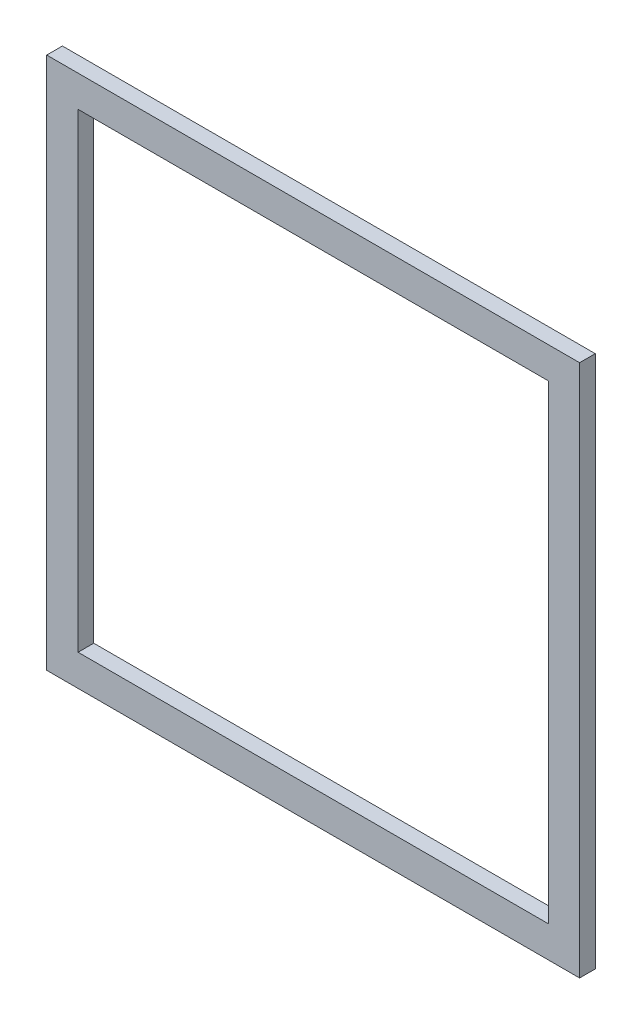
ISO-10303-21;
HEADER;
FILE_DESCRIPTION(('STEP AP214'),'2;1');
FILE_NAME('part.step','',(''),(''),'','','');
FILE_SCHEMA(('AUTOMOTIVE_DESIGN { 1 0 10303 214 1 1 1 1 }'));
ENDSEC;
DATA;
#1=APPLICATION_CONTEXT('core data for automotive mechanical design processes');
#2=APPLICATION_PROTOCOL_DEFINITION('international standard','automotive_design',2000,#1);
#3=PRODUCT_CONTEXT('',#1,'mechanical');
#4=PRODUCT('Part','Part','',(#3));
#5=PRODUCT_RELATED_PRODUCT_CATEGORY('part','',(#4));
#6=PRODUCT_DEFINITION_FORMATION('','',#4);
#7=PRODUCT_DEFINITION_CONTEXT('part definition',#1,'design');
#8=PRODUCT_DEFINITION('design','',#6,#7);
#9=PRODUCT_DEFINITION_SHAPE('','',#8);
#10=(LENGTH_UNIT() NAMED_UNIT(*) SI_UNIT(.MILLI.,.METRE.));
#11=(NAMED_UNIT(*) PLANE_ANGLE_UNIT() SI_UNIT($,.RADIAN.));
#12=(NAMED_UNIT(*) SI_UNIT($,.STERADIAN.) SOLID_ANGLE_UNIT());
#13=UNCERTAINTY_MEASURE_WITH_UNIT(LENGTH_MEASURE(1.E-05),#10,'distance_accuracy_value','');
#14=(GEOMETRIC_REPRESENTATION_CONTEXT(3) GLOBAL_UNCERTAINTY_ASSIGNED_CONTEXT((#13)) GLOBAL_UNIT_ASSIGNED_CONTEXT((#10,
#11,#12)) REPRESENTATION_CONTEXT('',''));
#15=CARTESIAN_POINT('',(0.,0.,0.));
#16=DIRECTION('',(0.,0.,1.));
#17=DIRECTION('',(1.,0.,0.));
#18=AXIS2_PLACEMENT_3D('',#15,#16,#17);
#19=CARTESIAN_POINT('',(0.,0.,1.));
#20=DIRECTION('',(0.,0.,-1.));
#21=DIRECTION('',(-1.,0.,0.));
#22=AXIS2_PLACEMENT_3D('',#19,#20,#21);
#23=PLANE('',#22);
#24=DIRECTION('',(0.,1.,0.));
#25=VECTOR('',#24,1.);
#26=CARTESIAN_POINT('',(17.,-17.,1.));
#27=LINE('',#26,#25);
#28=CARTESIAN_POINT('',(17.,-17.,1.));
#29=VERTEX_POINT('',#28);
#30=CARTESIAN_POINT('',(17.,17.,1.));
#31=VERTEX_POINT('',#30);
#32=EDGE_CURVE('E138',#29,#31,#27,.T.);
#33=ORIENTED_EDGE('',*,*,#32,.T.);
#34=DIRECTION('',(-1.,0.,0.));
#35=VECTOR('',#34,1.);
#36=CARTESIAN_POINT('',(-17.,17.,1.));
#37=LINE('',#36,#35);
#38=CARTESIAN_POINT('',(-17.,17.,1.));
#39=VERTEX_POINT('',#38);
#40=EDGE_CURVE('E141',#31,#39,#37,.T.);
#41=ORIENTED_EDGE('',*,*,#40,.T.);
#42=DIRECTION('',(0.,-1.,0.));
#43=VECTOR('',#42,1.);
#44=CARTESIAN_POINT('',(-17.,-17.,1.));
#45=LINE('',#44,#43);
#46=CARTESIAN_POINT('',(-17.,-17.,1.));
#47=VERTEX_POINT('',#46);
#48=EDGE_CURVE('E144',#39,#47,#45,.T.);
#49=ORIENTED_EDGE('',*,*,#48,.T.);
#50=DIRECTION('',(1.,0.,0.));
#51=VECTOR('',#50,1.);
#52=CARTESIAN_POINT('',(-17.,-17.,1.));
#53=LINE('',#52,#51);
#54=EDGE_CURVE('E146',#47,#29,#53,.T.);
#55=ORIENTED_EDGE('',*,*,#54,.T.);
#56=EDGE_LOOP('',(#33,#41,#49,#55));
#57=FACE_BOUND('',#56,.T.);
#58=DIRECTION('',(0.,1.,0.));
#59=VECTOR('',#58,1.);
#60=CARTESIAN_POINT('',(15.,-15.,1.));
#61=LINE('',#60,#59);
#62=CARTESIAN_POINT('',(15.,-15.,1.));
#63=VERTEX_POINT('',#62);
#64=CARTESIAN_POINT('',(15.,15.,1.));
#65=VERTEX_POINT('',#64);
#66=EDGE_CURVE('E102',#63,#65,#61,.T.);
#67=ORIENTED_EDGE('',*,*,#66,.F.);
#68=DIRECTION('',(1.,0.,0.));
#69=VECTOR('',#68,1.);
#70=CARTESIAN_POINT('',(-15.,-15.,1.));
#71=LINE('',#70,#69);
#72=CARTESIAN_POINT('',(-15.,-15.,1.));
#73=VERTEX_POINT('',#72);
#74=EDGE_CURVE('E124',#73,#63,#71,.T.);
#75=ORIENTED_EDGE('',*,*,#74,.F.);
#76=DIRECTION('',(0.,-1.,0.));
#77=VECTOR('',#76,1.);
#78=CARTESIAN_POINT('',(-15.,-15.,1.));
#79=LINE('',#78,#77);
#80=CARTESIAN_POINT('',(-15.,15.,1.));
#81=VERTEX_POINT('',#80);
#82=EDGE_CURVE('E122',#81,#73,#79,.T.);
#83=ORIENTED_EDGE('',*,*,#82,.F.);
#84=DIRECTION('',(-1.,0.,0.));
#85=VECTOR('',#84,1.);
#86=CARTESIAN_POINT('',(-15.,15.,1.));
#87=LINE('',#86,#85);
#88=EDGE_CURVE('E110',#65,#81,#87,.T.);
#89=ORIENTED_EDGE('',*,*,#88,.F.);
#90=EDGE_LOOP('',(#67,#75,#83,#89));
#91=FACE_BOUND('',#90,.T.);
#92=ADVANCED_FACE('F37',(#57,#91),#23,.F.);
#93=CARTESIAN_POINT('',(0.,0.,0.));
#94=DIRECTION('',(0.,0.,-1.));
#95=DIRECTION('',(-1.,0.,0.));
#96=AXIS2_PLACEMENT_3D('',#93,#94,#95);
#97=PLANE('',#96);
#98=DIRECTION('',(0.,1.,0.));
#99=VECTOR('',#98,1.);
#100=CARTESIAN_POINT('',(17.,-17.,0.));
#101=LINE('',#100,#99);
#102=CARTESIAN_POINT('',(17.,-17.,0.));
#103=VERTEX_POINT('',#102);
#104=CARTESIAN_POINT('',(17.,17.,0.));
#105=VERTEX_POINT('',#104);
#106=EDGE_CURVE('E118',#103,#105,#101,.T.);
#107=ORIENTED_EDGE('',*,*,#106,.F.);
#108=DIRECTION('',(1.,0.,0.));
#109=VECTOR('',#108,1.);
#110=CARTESIAN_POINT('',(-17.,-17.,0.));
#111=LINE('',#110,#109);
#112=CARTESIAN_POINT('',(-17.,-17.,0.));
#113=VERTEX_POINT('',#112);
#114=EDGE_CURVE('E142',#113,#103,#111,.T.);
#115=ORIENTED_EDGE('',*,*,#114,.F.);
#116=DIRECTION('',(0.,-1.,0.));
#117=VECTOR('',#116,1.);
#118=CARTESIAN_POINT('',(-17.,-17.,0.));
#119=LINE('',#118,#117);
#120=CARTESIAN_POINT('',(-17.,17.,0.));
#121=VERTEX_POINT('',#120);
#122=EDGE_CURVE('E153',#121,#113,#119,.T.);
#123=ORIENTED_EDGE('',*,*,#122,.F.);
#124=DIRECTION('',(-1.,0.,0.));
#125=VECTOR('',#124,1.);
#126=CARTESIAN_POINT('',(-17.,17.,0.));
#127=LINE('',#126,#125);
#128=EDGE_CURVE('E151',#105,#121,#127,.T.);
#129=ORIENTED_EDGE('',*,*,#128,.F.);
#130=EDGE_LOOP('',(#107,#115,#123,#129));
#131=FACE_BOUND('',#130,.T.);
#132=DIRECTION('',(1.,0.,0.));
#133=VECTOR('',#132,1.);
#134=CARTESIAN_POINT('',(-15.,-15.,0.));
#135=LINE('',#134,#133);
#136=CARTESIAN_POINT('',(-15.,-15.,0.));
#137=VERTEX_POINT('',#136);
#138=CARTESIAN_POINT('',(15.,-15.,0.));
#139=VERTEX_POINT('',#138);
#140=EDGE_CURVE('E111',#137,#139,#135,.T.);
#141=ORIENTED_EDGE('',*,*,#140,.T.);
#142=DIRECTION('',(0.,1.,0.));
#143=VECTOR('',#142,1.);
#144=CARTESIAN_POINT('',(15.,-15.,0.));
#145=LINE('',#144,#143);
#146=CARTESIAN_POINT('',(15.,15.,0.));
#147=VERTEX_POINT('',#146);
#148=EDGE_CURVE('E60',#139,#147,#145,.T.);
#149=ORIENTED_EDGE('',*,*,#148,.T.);
#150=DIRECTION('',(-1.,0.,0.));
#151=VECTOR('',#150,1.);
#152=CARTESIAN_POINT('',(-15.,15.,0.));
#153=LINE('',#152,#151);
#154=CARTESIAN_POINT('',(-15.,15.,0.));
#155=VERTEX_POINT('',#154);
#156=EDGE_CURVE('E117',#147,#155,#153,.T.);
#157=ORIENTED_EDGE('',*,*,#156,.T.);
#158=DIRECTION('',(0.,-1.,0.));
#159=VECTOR('',#158,1.);
#160=CARTESIAN_POINT('',(-15.,-15.,0.));
#161=LINE('',#160,#159);
#162=EDGE_CURVE('E130',#155,#137,#161,.T.);
#163=ORIENTED_EDGE('',*,*,#162,.T.);
#164=EDGE_LOOP('',(#141,#149,#157,#163));
#165=FACE_BOUND('',#164,.T.);
#166=ADVANCED_FACE('F171',(#131,#165),#97,.T.);
#167=CARTESIAN_POINT('',(17.,-17.,1.));
#168=DIRECTION('',(-1.,0.,0.));
#169=DIRECTION('',(0.,0.,1.));
#170=AXIS2_PLACEMENT_3D('',#167,#168,#169);
#171=PLANE('',#170);
#172=ORIENTED_EDGE('',*,*,#106,.T.);
#173=DIRECTION('',(0.,0.,-1.));
#174=VECTOR('',#173,1.);
#175=CARTESIAN_POINT('',(17.,17.,1.));
#176=LINE('',#175,#174);
#177=EDGE_CURVE('E11',#31,#105,#176,.T.);
#178=ORIENTED_EDGE('',*,*,#177,.F.);
#179=ORIENTED_EDGE('',*,*,#32,.F.);
#180=DIRECTION('',(0.,0.,-1.));
#181=VECTOR('',#180,1.);
#182=CARTESIAN_POINT('',(17.,-17.,1.));
#183=LINE('',#182,#181);
#184=EDGE_CURVE('E148',#29,#103,#183,.T.);
#185=ORIENTED_EDGE('',*,*,#184,.T.);
#186=EDGE_LOOP('',(#172,#178,#179,#185));
#187=FACE_BOUND('',#186,.T.);
#188=ADVANCED_FACE('F39',(#187),#171,.F.);
#189=CARTESIAN_POINT('',(-17.,17.,1.));
#190=DIRECTION('',(0.,-1.,0.));
#191=DIRECTION('',(0.,0.,-1.));
#192=AXIS2_PLACEMENT_3D('',#189,#190,#191);
#193=PLANE('',#192);
#194=ORIENTED_EDGE('',*,*,#128,.T.);
#195=DIRECTION('',(0.,0.,-1.));
#196=VECTOR('',#195,1.);
#197=CARTESIAN_POINT('',(-17.,17.,1.));
#198=LINE('',#197,#196);
#199=EDGE_CURVE('E45',#39,#121,#198,.T.);
#200=ORIENTED_EDGE('',*,*,#199,.F.);
#201=ORIENTED_EDGE('',*,*,#40,.F.);
#202=ORIENTED_EDGE('',*,*,#177,.T.);
#203=EDGE_LOOP('',(#194,#200,#201,#202));
#204=FACE_BOUND('',#203,.T.);
#205=ADVANCED_FACE('F181',(#204),#193,.F.);
#206=CARTESIAN_POINT('',(-17.,-17.,1.));
#207=DIRECTION('',(1.,0.,0.));
#208=DIRECTION('',(0.,0.,-1.));
#209=AXIS2_PLACEMENT_3D('',#206,#207,#208);
#210=PLANE('',#209);
#211=ORIENTED_EDGE('',*,*,#122,.T.);
#212=DIRECTION('',(0.,0.,-1.));
#213=VECTOR('',#212,1.);
#214=CARTESIAN_POINT('',(-17.,-17.,1.));
#215=LINE('',#214,#213);
#216=EDGE_CURVE('E158',#47,#113,#215,.T.);
#217=ORIENTED_EDGE('',*,*,#216,.F.);
#218=ORIENTED_EDGE('',*,*,#48,.F.);
#219=ORIENTED_EDGE('',*,*,#199,.T.);
#220=EDGE_LOOP('',(#211,#217,#218,#219));
#221=FACE_BOUND('',#220,.T.);
#222=ADVANCED_FACE('F165',(#221),#210,.F.);
#223=CARTESIAN_POINT('',(-17.,-17.,1.));
#224=DIRECTION('',(0.,1.,0.));
#225=DIRECTION('',(0.,0.,1.));
#226=AXIS2_PLACEMENT_3D('',#223,#224,#225);
#227=PLANE('',#226);
#228=ORIENTED_EDGE('',*,*,#114,.T.);
#229=ORIENTED_EDGE('',*,*,#184,.F.);
#230=ORIENTED_EDGE('',*,*,#54,.F.);
#231=ORIENTED_EDGE('',*,*,#216,.T.);
#232=EDGE_LOOP('',(#228,#229,#230,#231));
#233=FACE_BOUND('',#232,.T.);
#234=ADVANCED_FACE('F175',(#233),#227,.F.);
#235=CARTESIAN_POINT('',(15.,-15.,1.));
#236=DIRECTION('',(-1.,0.,0.));
#237=DIRECTION('',(0.,0.,1.));
#238=AXIS2_PLACEMENT_3D('',#235,#236,#237);
#239=PLANE('',#238);
#240=ORIENTED_EDGE('',*,*,#148,.F.);
#241=DIRECTION('',(0.,0.,-1.));
#242=VECTOR('',#241,1.);
#243=CARTESIAN_POINT('',(15.,-15.,1.));
#244=LINE('',#243,#242);
#245=EDGE_CURVE('E106',#63,#139,#244,.T.);
#246=ORIENTED_EDGE('',*,*,#245,.F.);
#247=ORIENTED_EDGE('',*,*,#66,.T.);
#248=DIRECTION('',(0.,0.,-1.));
#249=VECTOR('',#248,1.);
#250=CARTESIAN_POINT('',(15.,15.,1.));
#251=LINE('',#250,#249);
#252=EDGE_CURVE('E105',#65,#147,#251,.T.);
#253=ORIENTED_EDGE('',*,*,#252,.T.);
#254=EDGE_LOOP('',(#240,#246,#247,#253));
#255=FACE_BOUND('',#254,.T.);
#256=ADVANCED_FACE('F104',(#255),#239,.T.);
#257=CARTESIAN_POINT('',(-15.,15.,1.));
#258=DIRECTION('',(0.,-1.,0.));
#259=DIRECTION('',(0.,0.,-1.));
#260=AXIS2_PLACEMENT_3D('',#257,#258,#259);
#261=PLANE('',#260);
#262=ORIENTED_EDGE('',*,*,#156,.F.);
#263=ORIENTED_EDGE('',*,*,#252,.F.);
#264=ORIENTED_EDGE('',*,*,#88,.T.);
#265=DIRECTION('',(0.,0.,-1.));
#266=VECTOR('',#265,1.);
#267=CARTESIAN_POINT('',(-15.,15.,1.));
#268=LINE('',#267,#266);
#269=EDGE_CURVE('E119',#81,#155,#268,.T.);
#270=ORIENTED_EDGE('',*,*,#269,.T.);
#271=EDGE_LOOP('',(#262,#263,#264,#270));
#272=FACE_BOUND('',#271,.T.);
#273=ADVANCED_FACE('F114',(#272),#261,.T.);
#274=CARTESIAN_POINT('',(-15.,-15.,1.));
#275=DIRECTION('',(1.,0.,0.));
#276=DIRECTION('',(0.,0.,-1.));
#277=AXIS2_PLACEMENT_3D('',#274,#275,#276);
#278=PLANE('',#277);
#279=ORIENTED_EDGE('',*,*,#162,.F.);
#280=ORIENTED_EDGE('',*,*,#269,.F.);
#281=ORIENTED_EDGE('',*,*,#82,.T.);
#282=DIRECTION('',(0.,0.,-1.));
#283=VECTOR('',#282,1.);
#284=CARTESIAN_POINT('',(-15.,-15.,1.));
#285=LINE('',#284,#283);
#286=EDGE_CURVE('E52',#73,#137,#285,.T.);
#287=ORIENTED_EDGE('',*,*,#286,.T.);
#288=EDGE_LOOP('',(#279,#280,#281,#287));
#289=FACE_BOUND('',#288,.T.);
#290=ADVANCED_FACE('F204',(#289),#278,.T.);
#291=CARTESIAN_POINT('',(-15.,-15.,1.));
#292=DIRECTION('',(0.,1.,0.));
#293=DIRECTION('',(0.,0.,1.));
#294=AXIS2_PLACEMENT_3D('',#291,#292,#293);
#295=PLANE('',#294);
#296=ORIENTED_EDGE('',*,*,#140,.F.);
#297=ORIENTED_EDGE('',*,*,#286,.F.);
#298=ORIENTED_EDGE('',*,*,#74,.T.);
#299=ORIENTED_EDGE('',*,*,#245,.T.);
#300=EDGE_LOOP('',(#296,#297,#298,#299));
#301=FACE_BOUND('',#300,.T.);
#302=ADVANCED_FACE('F208',(#301),#295,.T.);
#303=CLOSED_SHELL('',(#92,#166,#188,#205,#222,#234,#256,#273,#290,#302));
#304=MANIFOLD_SOLID_BREP('B2',#303);
#305=ADVANCED_BREP_SHAPE_REPRESENTATION('',(#18,#304),#14);
#306=SHAPE_DEFINITION_REPRESENTATION(#9,#305);
ENDSEC;
END-ISO-10303-21;
